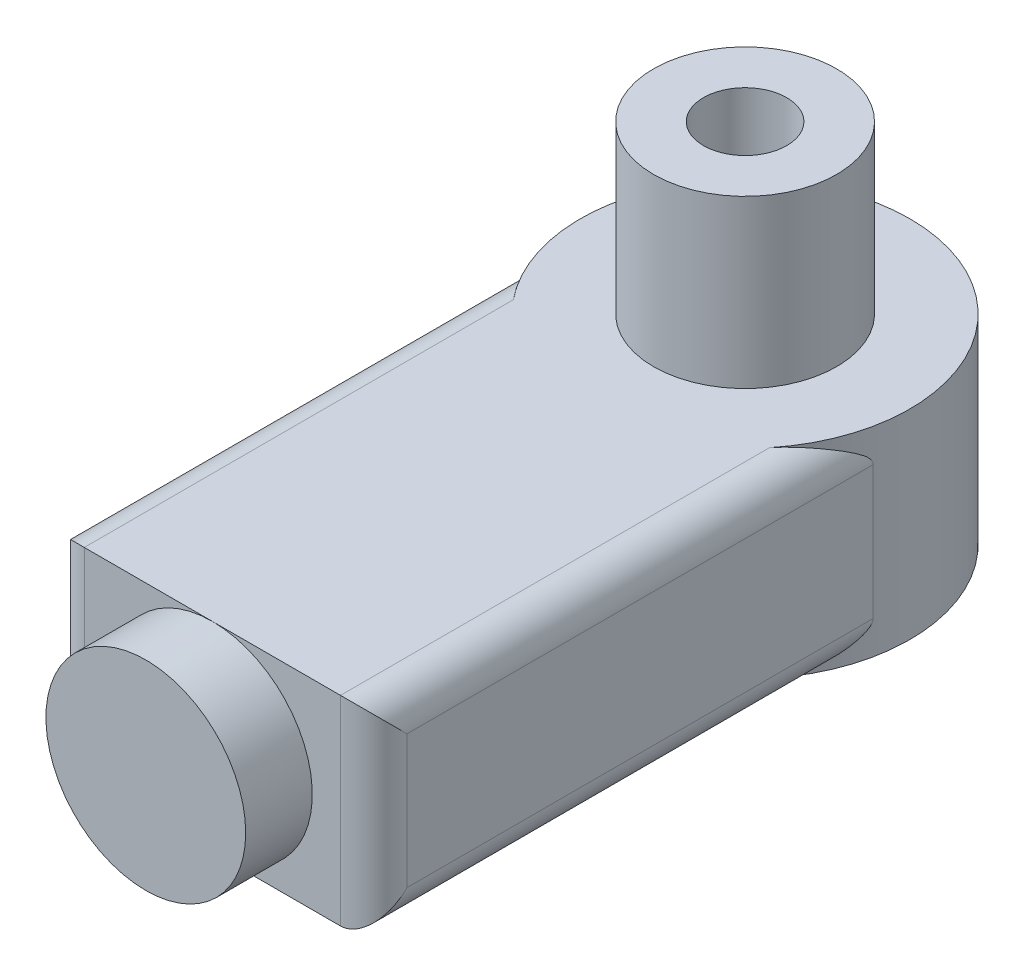
ISO-10303-21;
HEADER;
FILE_DESCRIPTION(('STEP AP214'),'2;1');
FILE_NAME('part.step','',(''),(''),'','','');
FILE_SCHEMA(('AUTOMOTIVE_DESIGN { 1 0 10303 214 1 1 1 1 }'));
ENDSEC;
DATA;
#1=APPLICATION_CONTEXT('core data for automotive mechanical design processes');
#2=APPLICATION_PROTOCOL_DEFINITION('international standard','automotive_design',2000,#1);
#3=PRODUCT_CONTEXT('',#1,'mechanical');
#4=PRODUCT('Part','Part','',(#3));
#5=PRODUCT_RELATED_PRODUCT_CATEGORY('part','',(#4));
#6=PRODUCT_DEFINITION_FORMATION('','',#4);
#7=PRODUCT_DEFINITION_CONTEXT('part definition',#1,'design');
#8=PRODUCT_DEFINITION('design','',#6,#7);
#9=PRODUCT_DEFINITION_SHAPE('','',#8);
#10=(LENGTH_UNIT() NAMED_UNIT(*) SI_UNIT(.MILLI.,.METRE.));
#11=(NAMED_UNIT(*) PLANE_ANGLE_UNIT() SI_UNIT($,.RADIAN.));
#12=(NAMED_UNIT(*) SI_UNIT($,.STERADIAN.) SOLID_ANGLE_UNIT());
#13=UNCERTAINTY_MEASURE_WITH_UNIT(LENGTH_MEASURE(1.E-05),#10,'distance_accuracy_value','');
#14=(GEOMETRIC_REPRESENTATION_CONTEXT(3) GLOBAL_UNCERTAINTY_ASSIGNED_CONTEXT((#13)) GLOBAL_UNIT_ASSIGNED_CONTEXT((#10,
#11,#12)) REPRESENTATION_CONTEXT('',''));
#15=CARTESIAN_POINT('',(0.,0.,0.));
#16=DIRECTION('',(0.,0.,1.));
#17=DIRECTION('',(1.,0.,0.));
#18=AXIS2_PLACEMENT_3D('',#15,#16,#17);
#19=CARTESIAN_POINT('',(0.,11.,0.));
#20=DIRECTION('',(0.,1.,0.));
#21=DIRECTION('',(0.,0.,1.));
#22=AXIS2_PLACEMENT_3D('',#19,#20,#21);
#23=PLANE('',#22);
#24=CARTESIAN_POINT('',(0.,11.,0.));
#25=DIRECTION('',(0.,1.,0.));
#26=DIRECTION('',(0.,0.,1.));
#27=AXIS2_PLACEMENT_3D('',#24,#25,#26);
#28=CIRCLE('',#27,2.75);
#29=CARTESIAN_POINT('',(0.,11.,2.75));
#30=VERTEX_POINT('',#29);
#31=EDGE_CURVE('E11',#30,#30,#28,.T.);
#32=ORIENTED_EDGE('',*,*,#31,.T.);
#33=EDGE_LOOP('',(#32));
#34=FACE_BOUND('',#33,.T.);
#35=CARTESIAN_POINT('',(0.,11.,0.));
#36=DIRECTION('',(0.,1.,0.));
#37=DIRECTION('',(0.,0.,1.));
#38=AXIS2_PLACEMENT_3D('',#35,#36,#37);
#39=CIRCLE('',#38,1.25);
#40=CARTESIAN_POINT('',(0.,11.,1.25));
#41=VERTEX_POINT('',#40);
#42=EDGE_CURVE('E51',#41,#41,#39,.T.);
#43=ORIENTED_EDGE('',*,*,#42,.F.);
#44=EDGE_LOOP('',(#43));
#45=FACE_BOUND('',#44,.T.);
#46=ADVANCED_FACE('F40',(#34,#45),#23,.T.);
#47=CARTESIAN_POINT('',(0.,6.,0.));
#48=DIRECTION('',(0.,1.,0.));
#49=DIRECTION('',(0.,0.,1.));
#50=AXIS2_PLACEMENT_3D('',#47,#48,#49);
#51=PLANE('',#50);
#52=CARTESIAN_POINT('',(0.,6.,0.));
#53=DIRECTION('',(0.,1.,0.));
#54=DIRECTION('',(0.,0.,1.));
#55=AXIS2_PLACEMENT_3D('',#52,#53,#54);
#56=CIRCLE('',#55,2.75);
#57=CARTESIAN_POINT('',(0.,6.,2.75));
#58=VERTEX_POINT('',#57);
#59=EDGE_CURVE('E44',#58,#58,#56,.T.);
#60=ORIENTED_EDGE('',*,*,#59,.F.);
#61=EDGE_LOOP('',(#60));
#62=FACE_BOUND('',#61,.T.);
#63=CARTESIAN_POINT('',(0.,6.,0.));
#64=DIRECTION('',(0.,1.,0.));
#65=DIRECTION('',(0.,0.,1.));
#66=AXIS2_PLACEMENT_3D('',#63,#64,#65);
#67=CIRCLE('',#66,1.25);
#68=CARTESIAN_POINT('',(0.,6.,1.25));
#69=VERTEX_POINT('',#68);
#70=EDGE_CURVE('E53',#69,#69,#67,.T.);
#71=ORIENTED_EDGE('',*,*,#70,.T.);
#72=EDGE_LOOP('',(#71));
#73=FACE_BOUND('',#72,.T.);
#74=ADVANCED_FACE('F63',(#62,#73),#51,.F.);
#75=CARTESIAN_POINT('',(0.,11.,0.));
#76=DIRECTION('',(0.,-1.,0.));
#77=DIRECTION('',(0.,0.,-1.));
#78=AXIS2_PLACEMENT_3D('',#75,#76,#77);
#79=CYLINDRICAL_SURFACE('',#78,2.75);
#80=ORIENTED_EDGE('',*,*,#31,.F.);
#81=EDGE_LOOP('',(#80));
#82=FACE_BOUND('',#81,.T.);
#83=ORIENTED_EDGE('',*,*,#59,.T.);
#84=EDGE_LOOP('',(#83));
#85=FACE_BOUND('',#84,.T.);
#86=ADVANCED_FACE('F42',(#82,#85),#79,.T.);
#87=CARTESIAN_POINT('',(0.,11.,0.));
#88=DIRECTION('',(0.,-1.,0.));
#89=DIRECTION('',(0.,0.,-1.));
#90=AXIS2_PLACEMENT_3D('',#87,#88,#89);
#91=CYLINDRICAL_SURFACE('',#90,1.25);
#92=ORIENTED_EDGE('',*,*,#42,.T.);
#93=EDGE_LOOP('',(#92));
#94=FACE_BOUND('',#93,.T.);
#95=ORIENTED_EDGE('',*,*,#70,.F.);
#96=EDGE_LOOP('',(#95));
#97=FACE_BOUND('',#96,.T.);
#98=ADVANCED_FACE('F59',(#94,#97),#91,.F.);
#99=CLOSED_SHELL('',(#46,#74,#86,#98));
#100=MANIFOLD_SOLID_BREP('B2',#99);
#101=CARTESIAN_POINT('',(-4.84736548441316,6.,16.));
#102=DIRECTION('',(0.,0.,-1.));
#103=DIRECTION('',(-1.,0.,0.));
#104=AXIS2_PLACEMENT_3D('',#101,#102,#103);
#105=PLANE('',#104);
#106=DIRECTION('',(1.,0.,0.));
#107=VECTOR('',#106,1.);
#108=CARTESIAN_POINT('',(-4.84736548441316,6.,16.));
#109=LINE('',#108,#107);
#110=CARTESIAN_POINT('',(-3.84736548441316,6.,16.));
#111=VERTEX_POINT('',#110);
#112=CARTESIAN_POINT('',(0.,6.,16.));
#113=VERTEX_POINT('',#112);
#114=EDGE_CURVE('E178',#111,#113,#109,.T.);
#115=ORIENTED_EDGE('',*,*,#114,.F.);
#116=DIRECTION('',(0.,-1.,0.));
#117=VECTOR('',#116,1.);
#118=CARTESIAN_POINT('',(-3.84736548441316,6.,16.));
#119=LINE('',#118,#117);
#120=CARTESIAN_POINT('',(-3.84736548441316,0.,16.));
#121=VERTEX_POINT('',#120);
#122=EDGE_CURVE('E239',#111,#121,#119,.T.);
#123=ORIENTED_EDGE('',*,*,#122,.T.);
#124=DIRECTION('',(1.,0.,0.));
#125=VECTOR('',#124,1.);
#126=CARTESIAN_POINT('',(-4.84736548441316,0.,16.));
#127=LINE('',#126,#125);
#128=CARTESIAN_POINT('',(0.,0.,16.));
#129=VERTEX_POINT('',#128);
#130=EDGE_CURVE('E202',#121,#129,#127,.T.);
#131=ORIENTED_EDGE('',*,*,#130,.T.);
#132=CARTESIAN_POINT('',(0.,3.,16.));
#133=DIRECTION('',(0.,0.,1.));
#134=DIRECTION('',(1.,0.,0.));
#135=AXIS2_PLACEMENT_3D('',#132,#133,#134);
#136=CIRCLE('',#135,3.);
#137=EDGE_CURVE('E200',#113,#129,#136,.T.);
#138=ORIENTED_EDGE('',*,*,#137,.F.);
#139=EDGE_LOOP('',(#115,#123,#131,#138));
#140=FACE_BOUND('',#139,.T.);
#141=ADVANCED_FACE('F101',(#140),#105,.F.);
#142=CARTESIAN_POINT('',(4.84736548441316,6.,1.));
#143=DIRECTION('',(1.,0.,0.));
#144=DIRECTION('',(0.,0.,-1.));
#145=AXIS2_PLACEMENT_3D('',#142,#143,#144);
#146=PLANE('',#145);
#147=DIRECTION('',(0.,-1.,0.));
#148=VECTOR('',#147,1.);
#149=CARTESIAN_POINT('',(4.84736548441316,6.,1.));
#150=LINE('',#149,#148);
#151=CARTESIAN_POINT('',(4.84736548441316,5.,1.));
#152=VERTEX_POINT('',#151);
#153=CARTESIAN_POINT('',(4.84736548441316,1.,1.));
#154=VERTEX_POINT('',#153);
#155=EDGE_CURVE('E209',#152,#154,#150,.T.);
#156=ORIENTED_EDGE('',*,*,#155,.F.);
#157=DIRECTION('',(0.,0.,1.));
#158=VECTOR('',#157,1.);
#159=CARTESIAN_POINT('',(4.84736548441316,5.,1.));
#160=LINE('',#159,#158);
#161=CARTESIAN_POINT('',(4.84736548441316,5.,15.));
#162=VERTEX_POINT('',#161);
#163=EDGE_CURVE('E237',#152,#162,#160,.T.);
#164=ORIENTED_EDGE('',*,*,#163,.T.);
#165=DIRECTION('',(0.,-1.,0.));
#166=VECTOR('',#165,1.);
#167=CARTESIAN_POINT('',(4.84736548441316,0.,15.));
#168=LINE('',#167,#166);
#169=CARTESIAN_POINT('',(4.84736548441316,1.,15.));
#170=VERTEX_POINT('',#169);
#171=EDGE_CURVE('E119',#162,#170,#168,.T.);
#172=ORIENTED_EDGE('',*,*,#171,.T.);
#173=DIRECTION('',(0.,0.,1.));
#174=VECTOR('',#173,1.);
#175=CARTESIAN_POINT('',(4.84736548441316,1.,1.));
#176=LINE('',#175,#174);
#177=EDGE_CURVE('E235',#170,#154,#176,.F.);
#178=ORIENTED_EDGE('',*,*,#177,.T.);
#179=EDGE_LOOP('',(#156,#164,#172,#178));
#180=FACE_BOUND('',#179,.T.);
#181=ADVANCED_FACE('F269',(#180),#146,.T.);
#182=CARTESIAN_POINT('',(0.,6.,0.));
#183=DIRECTION('',(0.,-1.,0.));
#184=DIRECTION('',(0.,0.,-1.));
#185=AXIS2_PLACEMENT_3D('',#182,#183,#184);
#186=CYLINDRICAL_SURFACE('',#185,4.949439578324);
#187=CARTESIAN_POINT('',(0.,0.,0.));
#188=DIRECTION('',(0.,1.,0.));
#189=DIRECTION('',(0.,0.,1.));
#190=AXIS2_PLACEMENT_3D('',#187,#188,#189);
#191=CIRCLE('',#190,4.949439578324);
#192=CARTESIAN_POINT('',(3.84736548441316,0.,3.11363629360051));
#193=VERTEX_POINT('',#192);
#194=CARTESIAN_POINT('',(-3.84736548441316,0.,3.11363629360051));
#195=VERTEX_POINT('',#194);
#196=EDGE_CURVE('E198',#193,#195,#191,.T.);
#197=ORIENTED_EDGE('',*,*,#196,.T.);
#198=CARTESIAN_POINT('',(-3.84736548441316,0.,3.11363629360051));
#199=CARTESIAN_POINT('',(-3.89281727462984,2.98251887473271E-05,3.05748950664325));
#200=CARTESIAN_POINT('',(-3.93698176868843,0.00309578606745538,3.00038873130443));
#201=CARTESIAN_POINT('',(-4.02248361959575,0.0145027282662336,2.88473823258211));
#202=CARTESIAN_POINT('',(-4.06382505459908,0.0228359140066355,2.8261907731535));
#203=CARTESIAN_POINT('',(-4.14379241616999,0.0440455025861972,2.70759855111725));
#204=CARTESIAN_POINT('',(-4.1824013945703,0.0569477076054911,2.64754712323396));
#205=CARTESIAN_POINT('',(-4.25659452103735,0.0866930339336794,2.52653796459679));
#206=CARTESIAN_POINT('',(-4.29217744110034,0.103537744843388,2.46557987759034));
#207=CARTESIAN_POINT('',(-4.37430758908357,0.148334355198219,2.31779499630878));
#208=CARTESIAN_POINT('',(-4.41934233548354,0.178004666598062,2.23064401736269));
#209=CARTESIAN_POINT('',(-4.50340973320656,0.24339969810394,2.05564856468806));
#210=CARTESIAN_POINT('',(-4.54243684767344,0.279129940287717,1.96780352874191));
#211=CARTESIAN_POINT('',(-4.6143950818412,0.356223323865737,1.79254723900047));
#212=CARTESIAN_POINT('',(-4.6473505445337,0.397562764147221,1.7051356836443));
#213=CARTESIAN_POINT('',(-4.69233533585805,0.46451754732251,1.57513425061422));
#214=CARTESIAN_POINT('',(-4.70658129224892,0.487643962953936,1.53201322572609));
#215=CARTESIAN_POINT('',(-4.73358055597524,0.535897619173316,1.44643483368296));
#216=CARTESIAN_POINT('',(-4.74633449790931,0.561024001417684,1.40397719107821));
#217=CARTESIAN_POINT('',(-4.76640157692205,0.605340815358527,1.33387936626689));
#218=CARTESIAN_POINT('',(-4.77413671419236,0.623809646891943,1.30590417752581));
#219=CARTESIAN_POINT('',(-4.78887204234209,0.662370968508412,1.25078744891224));
#220=CARTESIAN_POINT('',(-4.79587078570187,0.682466523986641,1.22364762250757));
#221=CARTESIAN_POINT('',(-4.80907666095353,0.725019271824503,1.17067757929597));
#222=CARTESIAN_POINT('',(-4.81527654134315,0.747495124216086,1.14486048837391));
#223=CARTESIAN_POINT('',(-4.82659677682991,0.79573727772831,1.096140980642));
#224=CARTESIAN_POINT('',(-4.83172100762228,0.82149120905587,1.07322822170865));
#225=CARTESIAN_POINT('',(-4.83783889189717,0.861766988726351,1.04515337522625));
#226=CARTESIAN_POINT('',(-4.83951910914709,0.874291947268194,1.03733244209698));
#227=CARTESIAN_POINT('',(-4.84246712988467,0.900282907495009,1.02348076336158));
#228=CARTESIAN_POINT('',(-4.84373718901121,0.913743249815438,1.01744024310268));
#229=CARTESIAN_POINT('',(-4.84557994869563,0.939176734383413,1.00862541715542));
#230=CARTESIAN_POINT('',(-4.84623506365502,0.951006954780033,1.00546783298845));
#231=CARTESIAN_POINT('',(-4.84713423241671,0.975202989128045,1.00112136142261));
#232=CARTESIAN_POINT('',(-4.84737237180637,0.987573997427809,0.999960803911347));
#233=CARTESIAN_POINT('',(-4.84736548441316,0.999999999999999,0.999999999999997));
#234=B_SPLINE_CURVE_WITH_KNOTS('',3,(#198,#199,#200,#201,#202,#203,#204,#205,#206,#207,#208,
#209,#210,#211,#212,#213,#214,#215,#216,#217,#218,#219,#220,#221,#222,#223,#224,#225,#226,#227,
#228,#229,#230,#231,#232,#233),.UNSPECIFIED.,.F.,.F.,(4,2,2,2,2,2,2,2,2,2,2,2,2,2,2,2,2,4),(0.,
0.216535143167561,0.432750558753887,0.650206986287944,0.867751242787261,1.17480258975668,
1.48213525381358,1.78820756348574,1.94105134813977,2.09382988553935,2.19700231261004,
2.30037389760481,2.40462608718171,2.50849593910503,2.55297864224975,2.59721237635919,
2.63383074301909,2.67096442323406),.UNSPECIFIED.);
#235=CARTESIAN_POINT('',(-4.84736548441316,1.,1.));
#236=VERTEX_POINT('',#235);
#237=EDGE_CURVE('E251',#195,#236,#234,.T.);
#238=ORIENTED_EDGE('',*,*,#237,.T.);
#239=DIRECTION('',(0.,-1.,0.));
#240=VECTOR('',#239,1.);
#241=CARTESIAN_POINT('',(-4.84736548441316,6.,1.));
#242=LINE('',#241,#240);
#243=CARTESIAN_POINT('',(-4.84736548441316,5.,1.));
#244=VERTEX_POINT('',#243);
#245=EDGE_CURVE('E212',#244,#236,#242,.T.);
#246=ORIENTED_EDGE('',*,*,#245,.F.);
#247=CARTESIAN_POINT('',(-4.84736548441316,5.,1.));
#248=CARTESIAN_POINT('',(-4.84737307595143,5.01288840319748,0.999956672564238));
#249=CARTESIAN_POINT('',(-4.84711669443079,5.02571146266976,1.00120648351606));
#250=CARTESIAN_POINT('',(-4.84615278490311,5.05073461091079,1.00586483364969));
#251=CARTESIAN_POINT('',(-4.84545269217123,5.06294145313959,1.00923778902605));
#252=CARTESIAN_POINT('',(-4.84333944251579,5.09114152817548,1.01933730456198));
#253=CARTESIAN_POINT('',(-4.84175715485132,5.10683283626391,1.02684794291165));
#254=CARTESIAN_POINT('',(-4.83806074716588,5.13694962183925,1.04412621311549));
#255=CARTESIAN_POINT('',(-4.83594253537592,5.15136415268272,1.05391116025544));
#256=CARTESIAN_POINT('',(-4.83064377556704,5.18300593115654,1.07797222741758));
#257=CARTESIAN_POINT('',(-4.82733321470016,5.19983918507957,1.09272842283818));
#258=CARTESIAN_POINT('',(-4.82021820541154,5.23200833359732,1.12370117600226));
#259=CARTESIAN_POINT('',(-4.8164127474761,5.24734105211744,1.13992069740632));
#260=CARTESIAN_POINT('',(-4.80435959186667,5.29174138591236,1.19006579849173));
#261=CARTESIAN_POINT('',(-4.79549994892692,5.31907877696655,1.22536252470867));
#262=CARTESIAN_POINT('',(-4.77777208794515,5.36728882088111,1.29263143008758));
#263=CARTESIAN_POINT('',(-4.76907233976138,5.38853361875683,1.32439395861491));
#264=CARTESIAN_POINT('',(-4.75074971483621,5.42941658524038,1.38868484784914));
#265=CARTESIAN_POINT('',(-4.74112670691308,5.44905452480042,1.42121331688809));
#266=CARTESIAN_POINT('',(-4.71088902393771,5.50615418558199,1.51960007134321));
#267=CARTESIAN_POINT('',(-4.68893574962929,5.54172369720676,1.58614422174335));
#268=CARTESIAN_POINT('',(-4.64153392319824,5.60908422687354,1.71993264734043));
#269=CARTESIAN_POINT('',(-4.61608281262335,5.6408724470882,1.78717740140337));
#270=CARTESIAN_POINT('',(-4.56170667518593,5.70096861321623,1.92172926802425));
#271=CARTESIAN_POINT('',(-4.53278511910078,5.72927997989892,1.98903625257127));
#272=CARTESIAN_POINT('',(-4.47151609529522,5.78235019937197,2.12318556147885));
#273=CARTESIAN_POINT('',(-4.4391804393091,5.80712064498221,2.19002868713708));
#274=CARTESIAN_POINT('',(-4.37095292871354,5.85296293473344,2.32321389411166));
#275=CARTESIAN_POINT('',(-4.33505958767861,5.87403322264572,2.38955575343097));
#276=CARTESIAN_POINT('',(-4.25988643800206,5.91191551355002,2.52111746863686));
#277=CARTESIAN_POINT('',(-4.22062281366412,5.92874649144192,2.58634106076873));
#278=CARTESIAN_POINT('',(-4.13861186511317,5.95763491776477,2.71564009206927));
#279=CARTESIAN_POINT('',(-4.0958656816126,5.9696939217359,2.779715898873));
#280=CARTESIAN_POINT('',(-4.01916638491394,5.9856834482528,2.88901517726619));
#281=CARTESIAN_POINT('',(-3.98600612346842,5.99093509564627,2.93460147514712));
#282=CARTESIAN_POINT('',(-3.91794936830613,5.99809106929837,3.02486965878351));
#283=CARTESIAN_POINT('',(-3.88304948434331,5.99998857392191,3.06954951913067));
#284=CARTESIAN_POINT('',(-3.84736548441316,6.,3.11363629360051));
#285=B_SPLINE_CURVE_WITH_KNOTS('',3,(#247,#248,#249,#250,#251,#252,#253,#254,#255,#256,#257,
#258,#259,#260,#261,#262,#263,#264,#265,#266,#267,#268,#269,#270,#271,#272,#273,#274,#275,#276,
#277,#278,#279,#280,#281,#282,#283,#284),.UNSPECIFIED.,.F.,.F.,(4,2,2,2,2,2,2,2,2,2,2,2,2,2,2,2,
2,2,4),(0.,0.0384975484795086,0.0763664584605771,0.12847304669167,0.180990150672357,
0.248712757349987,0.316575740488891,0.452828711529017,0.57035870826645,0.687905429103769,
0.923425139799945,1.15911804472619,1.39457716857923,1.62924683058992,1.86401495584782,
2.09771281283462,2.33133442748244,2.50105659500522,2.67112354699958),.UNSPECIFIED.);
#286=CARTESIAN_POINT('',(-3.84736548441316,6.,3.11363629360051));
#287=VERTEX_POINT('',#286);
#288=EDGE_CURVE('E242',#244,#287,#285,.T.);
#289=ORIENTED_EDGE('',*,*,#288,.T.);
#290=CARTESIAN_POINT('',(0.,6.,0.));
#291=DIRECTION('',(0.,1.,0.));
#292=DIRECTION('',(0.,0.,1.));
#293=AXIS2_PLACEMENT_3D('',#290,#291,#292);
#294=CIRCLE('',#293,4.949439578324);
#295=CARTESIAN_POINT('',(3.84736548441316,6.,3.11363629360051));
#296=VERTEX_POINT('',#295);
#297=EDGE_CURVE('E187',#296,#287,#294,.T.);
#298=ORIENTED_EDGE('',*,*,#297,.F.);
#299=CARTESIAN_POINT('',(3.84736548441316,6.,3.11363629360051));
#300=CARTESIAN_POINT('',(3.89281727462984,5.99997017481125,3.05748950664325));
#301=CARTESIAN_POINT('',(3.93698176868843,5.99690421393254,3.00038873130443));
#302=CARTESIAN_POINT('',(4.02248361959575,5.98549727173377,2.88473823258211));
#303=CARTESIAN_POINT('',(4.06382505459908,5.97716408599336,2.8261907731535));
#304=CARTESIAN_POINT('',(4.14379241616999,5.9559544974138,2.70759855111725));
#305=CARTESIAN_POINT('',(4.1824013945703,5.94305229239451,2.64754712323396));
#306=CARTESIAN_POINT('',(4.25659452103735,5.91330696606632,2.52653796459679));
#307=CARTESIAN_POINT('',(4.29217744110034,5.89646225515661,2.46557987759034));
#308=CARTESIAN_POINT('',(4.37430758908357,5.85166564480178,2.31779499630878));
#309=CARTESIAN_POINT('',(4.41934233548354,5.82199533340194,2.23064401736269));
#310=CARTESIAN_POINT('',(4.50340973320656,5.75660030189606,2.05564856468806));
#311=CARTESIAN_POINT('',(4.54243684767344,5.72087005971228,1.96780352874191));
#312=CARTESIAN_POINT('',(4.6143950818412,5.64377667613426,1.79254723900047));
#313=CARTESIAN_POINT('',(4.6473505445337,5.60243723585278,1.7051356836443));
#314=CARTESIAN_POINT('',(4.69233533585805,5.53548245267749,1.57513425061422));
#315=CARTESIAN_POINT('',(4.70658129224892,5.51235603704606,1.53201322572609));
#316=CARTESIAN_POINT('',(4.73358055597524,5.46410238082668,1.44643483368296));
#317=CARTESIAN_POINT('',(4.74633449790931,5.43897599858232,1.40397719107821));
#318=CARTESIAN_POINT('',(4.76640157692205,5.39465918464147,1.33387936626689));
#319=CARTESIAN_POINT('',(4.77413671419236,5.37619035310806,1.30590417752581));
#320=CARTESIAN_POINT('',(4.78887204234209,5.33762903149159,1.25078744891224));
#321=CARTESIAN_POINT('',(4.79587078570187,5.31753347601336,1.22364762250757));
#322=CARTESIAN_POINT('',(4.80907666095353,5.2749807281755,1.17067757929597));
#323=CARTESIAN_POINT('',(4.81527654134315,5.25250487578391,1.14486048837391));
#324=CARTESIAN_POINT('',(4.8265967768299,5.20426272227169,1.096140980642));
#325=CARTESIAN_POINT('',(4.83172100762228,5.17850879094413,1.07322822170865));
#326=CARTESIAN_POINT('',(4.83783889189717,5.13823301127365,1.04515337522625));
#327=CARTESIAN_POINT('',(4.83951910914709,5.1257080527318,1.03733244209698));
#328=CARTESIAN_POINT('',(4.84246712988467,5.09971709250499,1.02348076336158));
#329=CARTESIAN_POINT('',(4.84373718901121,5.08625675018456,1.01744024310268));
#330=CARTESIAN_POINT('',(4.84557994869563,5.06082326561658,1.00862541715542));
#331=CARTESIAN_POINT('',(4.84623506365502,5.04899304521996,1.00546783298845));
#332=CARTESIAN_POINT('',(4.84713423241671,5.02479701087195,1.00112136142261));
#333=CARTESIAN_POINT('',(4.84737237180637,5.01242600257219,0.999960803911347));
#334=CARTESIAN_POINT('',(4.84736548441316,5.,0.999999999999997));
#335=B_SPLINE_CURVE_WITH_KNOTS('',3,(#299,#300,#301,#302,#303,#304,#305,#306,#307,#308,#309,
#310,#311,#312,#313,#314,#315,#316,#317,#318,#319,#320,#321,#322,#323,#324,#325,#326,#327,#328,
#329,#330,#331,#332,#333,#334),.UNSPECIFIED.,.F.,.F.,(4,2,2,2,2,2,2,2,2,2,2,2,2,2,2,2,2,4),(0.,
0.216535143167561,0.432750558753888,0.650206986287944,0.867751242787261,1.17480258975668,
1.48213525381358,1.78820756348574,1.94105134813977,2.09382988553935,2.19700231261004,
2.30037389760481,2.40462608718171,2.50849593910503,2.55297864224975,2.59721237635919,
2.63383074301909,2.67096442323406),.UNSPECIFIED.);
#336=EDGE_CURVE('E111',#296,#152,#335,.T.);
#337=ORIENTED_EDGE('',*,*,#336,.T.);
#338=ORIENTED_EDGE('',*,*,#155,.T.);
#339=CARTESIAN_POINT('',(4.84736548441316,1.,1.));
#340=CARTESIAN_POINT('',(4.84737307595143,0.987111596802519,0.999956672564239));
#341=CARTESIAN_POINT('',(4.84711669443079,0.974288537330241,1.00120648351606));
#342=CARTESIAN_POINT('',(4.84615278490311,0.949265389089207,1.00586483364969));
#343=CARTESIAN_POINT('',(4.84545269217123,0.937058546860406,1.00923778902605));
#344=CARTESIAN_POINT('',(4.84333944251579,0.908858471824523,1.01933730456198));
#345=CARTESIAN_POINT('',(4.84175715485132,0.893167163736092,1.02684794291166));
#346=CARTESIAN_POINT('',(4.83806074716588,0.863050378160746,1.0441262131155));
#347=CARTESIAN_POINT('',(4.83594253537592,0.848635847317282,1.05391116025544));
#348=CARTESIAN_POINT('',(4.83064377556704,0.816994068843457,1.07797222741759));
#349=CARTESIAN_POINT('',(4.82733321470016,0.800160814920428,1.09272842283818));
#350=CARTESIAN_POINT('',(4.82021820541154,0.767991666402679,1.12370117600227));
#351=CARTESIAN_POINT('',(4.8164127474761,0.752658947882564,1.13992069740632));
#352=CARTESIAN_POINT('',(4.80435959186667,0.708258614087636,1.19006579849174));
#353=CARTESIAN_POINT('',(4.79549994892692,0.680921223033447,1.22536252470867));
#354=CARTESIAN_POINT('',(4.77777208794515,0.632711179118887,1.29263143008758));
#355=CARTESIAN_POINT('',(4.76907233976138,0.61146638124317,1.32439395861491));
#356=CARTESIAN_POINT('',(4.75074971483621,0.57058341475962,1.38868484784914));
#357=CARTESIAN_POINT('',(4.74112670691308,0.55094547519958,1.42121331688809));
#358=CARTESIAN_POINT('',(4.71088902393771,0.493845814418007,1.51960007134321));
#359=CARTESIAN_POINT('',(4.68893574962929,0.458276302793236,1.58614422174336));
#360=CARTESIAN_POINT('',(4.64153392319824,0.390915773126458,1.71993264734043));
#361=CARTESIAN_POINT('',(4.61608281262335,0.3591275529118,1.78717740140337));
#362=CARTESIAN_POINT('',(4.56170667518593,0.29903138678377,1.92172926802425));
#363=CARTESIAN_POINT('',(4.53278511910078,0.270720020101078,1.98903625257127));
#364=CARTESIAN_POINT('',(4.47151609529522,0.217649800628031,2.12318556147885));
#365=CARTESIAN_POINT('',(4.4391804393091,0.192879355017789,2.19002868713708));
#366=CARTESIAN_POINT('',(4.37095292871354,0.147037065266563,2.32321389411166));
#367=CARTESIAN_POINT('',(4.33505958767861,0.125966777354279,2.38955575343097));
#368=CARTESIAN_POINT('',(4.25988643800206,0.0880844864499766,2.52111746863686));
#369=CARTESIAN_POINT('',(4.22062281366412,0.0712535085580823,2.58634106076873));
#370=CARTESIAN_POINT('',(4.13861186511317,0.0423650822352342,2.71564009206927));
#371=CARTESIAN_POINT('',(4.0958656816126,0.0303060782641058,2.779715898873));
#372=CARTESIAN_POINT('',(4.01916638491394,0.0143165517471987,2.88901517726619));
#373=CARTESIAN_POINT('',(3.98600612346842,0.00906490435372658,2.93460147514712));
#374=CARTESIAN_POINT('',(3.91794936830613,0.00190893070163007,3.02486965878351));
#375=CARTESIAN_POINT('',(3.88304948434331,1.14260780926861E-05,3.06954951913067));
#376=CARTESIAN_POINT('',(3.84736548441316,0.,3.11363629360051));
#377=B_SPLINE_CURVE_WITH_KNOTS('',3,(#339,#340,#341,#342,#343,#344,#345,#346,#347,#348,#349,
#350,#351,#352,#353,#354,#355,#356,#357,#358,#359,#360,#361,#362,#363,#364,#365,#366,#367,#368,
#369,#370,#371,#372,#373,#374,#375,#376),.UNSPECIFIED.,.F.,.F.,(4,2,2,2,2,2,2,2,2,2,2,2,2,2,2,2,
2,2,4),(0.,0.038497548479509,0.0763664584605773,0.128473046691671,0.180990150672359,
0.248712757349988,0.316575740488893,0.452828711529018,0.570358708266452,0.68790542910377,
0.923425139799946,1.15911804472619,1.39457716857923,1.62924683058992,1.86401495584781,
2.09771281283462,2.33133442748244,2.50105659500522,2.67112354699958),.UNSPECIFIED.);
#378=EDGE_CURVE('E38',#154,#193,#377,.T.);
#379=ORIENTED_EDGE('',*,*,#378,.T.);
#380=EDGE_LOOP('',(#197,#238,#246,#289,#298,#337,#338,#379));
#381=FACE_BOUND('',#380,.T.);
#382=ADVANCED_FACE('F258',(#381),#186,.T.);
#383=CARTESIAN_POINT('',(-4.84736548441316,6.,1.));
#384=DIRECTION('',(1.,0.,0.));
#385=DIRECTION('',(0.,0.,-1.));
#386=AXIS2_PLACEMENT_3D('',#383,#384,#385);
#387=PLANE('',#386);
#388=DIRECTION('',(0.,-1.,0.));
#389=VECTOR('',#388,1.);
#390=CARTESIAN_POINT('',(-4.84736548441316,6.,15.));
#391=LINE('',#390,#389);
#392=CARTESIAN_POINT('',(-4.84736548441316,1.,15.));
#393=VERTEX_POINT('',#392);
#394=CARTESIAN_POINT('',(-4.84736548441316,5.,15.));
#395=VERTEX_POINT('',#394);
#396=EDGE_CURVE('E223',#393,#395,#391,.F.);
#397=ORIENTED_EDGE('',*,*,#396,.T.);
#398=DIRECTION('',(0.,0.,1.));
#399=VECTOR('',#398,1.);
#400=CARTESIAN_POINT('',(-4.84736548441316,5.,1.));
#401=LINE('',#400,#399);
#402=EDGE_CURVE('E227',#395,#244,#401,.F.);
#403=ORIENTED_EDGE('',*,*,#402,.T.);
#404=ORIENTED_EDGE('',*,*,#245,.T.);
#405=DIRECTION('',(0.,0.,1.));
#406=VECTOR('',#405,1.);
#407=CARTESIAN_POINT('',(-4.84736548441316,1.,1.));
#408=LINE('',#407,#406);
#409=EDGE_CURVE('E225',#236,#393,#408,.T.);
#410=ORIENTED_EDGE('',*,*,#409,.T.);
#411=EDGE_LOOP('',(#397,#403,#404,#410));
#412=FACE_BOUND('',#411,.T.);
#413=ADVANCED_FACE('F317',(#412),#387,.F.);
#414=CARTESIAN_POINT('',(3.84736548441316,0.,16.));
#415=VERTEX_POINT('',#414);
#416=EDGE_CURVE('E218',#129,#415,#127,.T.);
#417=ORIENTED_EDGE('',*,*,#416,.T.);
#418=DIRECTION('',(0.,-1.,0.));
#419=VECTOR('',#418,1.);
#420=CARTESIAN_POINT('',(3.84736548441316,6.,16.));
#421=LINE('',#420,#419);
#422=CARTESIAN_POINT('',(3.84736548441316,6.,16.));
#423=VERTEX_POINT('',#422);
#424=EDGE_CURVE('E197',#415,#423,#421,.F.);
#425=ORIENTED_EDGE('',*,*,#424,.T.);
#426=EDGE_CURVE('E182',#113,#423,#109,.T.);
#427=ORIENTED_EDGE('',*,*,#426,.F.);
#428=EDGE_CURVE('E194',#129,#113,#136,.T.);
#429=ORIENTED_EDGE('',*,*,#428,.F.);
#430=EDGE_LOOP('',(#417,#425,#427,#429));
#431=FACE_BOUND('',#430,.T.);
#432=ADVANCED_FACE('F192',(#431),#105,.F.);
#433=CARTESIAN_POINT('',(0.,6.,0.));
#434=DIRECTION('',(0.,1.,0.));
#435=DIRECTION('',(0.,0.,1.));
#436=AXIS2_PLACEMENT_3D('',#433,#434,#435);
#437=PLANE('',#436);
#438=ORIENTED_EDGE('',*,*,#297,.T.);
#439=DIRECTION('',(0.,0.,1.));
#440=VECTOR('',#439,1.);
#441=CARTESIAN_POINT('',(-3.84736548441316,6.,16.));
#442=LINE('',#441,#440);
#443=EDGE_CURVE('E184',#287,#111,#442,.T.);
#444=ORIENTED_EDGE('',*,*,#443,.T.);
#445=ORIENTED_EDGE('',*,*,#114,.T.);
#446=ORIENTED_EDGE('',*,*,#426,.T.);
#447=DIRECTION('',(0.,0.,1.));
#448=VECTOR('',#447,1.);
#449=CARTESIAN_POINT('',(3.84736548441316,6.,0.));
#450=LINE('',#449,#448);
#451=EDGE_CURVE('E208',#423,#296,#450,.F.);
#452=ORIENTED_EDGE('',*,*,#451,.T.);
#453=EDGE_LOOP('',(#438,#444,#445,#446,#452));
#454=FACE_BOUND('',#453,.T.);
#455=ADVANCED_FACE('F180',(#454),#437,.T.);
#456=CARTESIAN_POINT('',(0.,0.,0.));
#457=DIRECTION('',(0.,1.,0.));
#458=DIRECTION('',(0.,0.,1.));
#459=AXIS2_PLACEMENT_3D('',#456,#457,#458);
#460=PLANE('',#459);
#461=ORIENTED_EDGE('',*,*,#130,.F.);
#462=DIRECTION('',(0.,0.,1.));
#463=VECTOR('',#462,1.);
#464=CARTESIAN_POINT('',(-3.84736548441316,0.,0.));
#465=LINE('',#464,#463);
#466=EDGE_CURVE('E231',#121,#195,#465,.F.);
#467=ORIENTED_EDGE('',*,*,#466,.T.);
#468=ORIENTED_EDGE('',*,*,#196,.F.);
#469=DIRECTION('',(0.,0.,1.));
#470=VECTOR('',#469,1.);
#471=CARTESIAN_POINT('',(3.84736548441316,0.,16.));
#472=LINE('',#471,#470);
#473=EDGE_CURVE('E229',#193,#415,#472,.T.);
#474=ORIENTED_EDGE('',*,*,#473,.T.);
#475=ORIENTED_EDGE('',*,*,#416,.F.);
#476=EDGE_LOOP('',(#461,#467,#468,#474,#475));
#477=FACE_BOUND('',#476,.T.);
#478=ADVANCED_FACE('F313',(#477),#460,.F.);
#479=CARTESIAN_POINT('',(0.,3.,18.));
#480=DIRECTION('',(0.,0.,-1.));
#481=DIRECTION('',(-1.,0.,0.));
#482=AXIS2_PLACEMENT_3D('',#479,#480,#481);
#483=CYLINDRICAL_SURFACE('',#482,3.);
#484=CARTESIAN_POINT('',(0.,3.,18.));
#485=DIRECTION('',(0.,0.,1.));
#486=DIRECTION('',(1.,0.,0.));
#487=AXIS2_PLACEMENT_3D('',#484,#485,#486);
#488=CIRCLE('',#487,3.);
#489=CARTESIAN_POINT('',(3.,3.,18.));
#490=VERTEX_POINT('',#489);
#491=EDGE_CURVE('E204',#490,#490,#488,.T.);
#492=ORIENTED_EDGE('',*,*,#491,.F.);
#493=EDGE_LOOP('',(#492));
#494=FACE_BOUND('',#493,.T.);
#495=ORIENTED_EDGE('',*,*,#137,.T.);
#496=ORIENTED_EDGE('',*,*,#428,.T.);
#497=EDGE_LOOP('',(#495,#496));
#498=FACE_BOUND('',#497,.T.);
#499=ADVANCED_FACE('F207',(#494,#498),#483,.T.);
#500=CARTESIAN_POINT('',(0.,3.,18.));
#501=DIRECTION('',(0.,0.,1.));
#502=DIRECTION('',(1.,0.,0.));
#503=AXIS2_PLACEMENT_3D('',#500,#501,#502);
#504=PLANE('',#503);
#505=ORIENTED_EDGE('',*,*,#491,.T.);
#506=EDGE_LOOP('',(#505));
#507=FACE_BOUND('',#506,.T.);
#508=ADVANCED_FACE('F277',(#507),#504,.T.);
#509=CARTESIAN_POINT('',(-3.84736548441316,1.,1.));
#510=DIRECTION('',(0.,0.,1.));
#511=DIRECTION('',(1.,0.,0.));
#512=AXIS2_PLACEMENT_3D('',#509,#510,#511);
#513=CYLINDRICAL_SURFACE('',#512,1.);
#514=ORIENTED_EDGE('',*,*,#237,.F.);
#515=ORIENTED_EDGE('',*,*,#466,.F.);
#516=CARTESIAN_POINT('',(-3.84736548441316,1.,15.));
#517=DIRECTION('',(0.,-0.707106781186547,-0.707106781186547));
#518=DIRECTION('',(0.,-0.707106781186547,0.707106781186547));
#519=AXIS2_PLACEMENT_3D('',#516,#517,#518);
#520=ELLIPSE('',#519,1.41421356237309,1.);
#521=EDGE_CURVE('E205',#393,#121,#520,.F.);
#522=ORIENTED_EDGE('',*,*,#521,.F.);
#523=ORIENTED_EDGE('',*,*,#409,.F.);
#524=EDGE_LOOP('',(#514,#515,#522,#523));
#525=FACE_BOUND('',#524,.T.);
#526=ADVANCED_FACE('F272',(#525),#513,.T.);
#527=CARTESIAN_POINT('',(-3.84736548441316,6.,15.));
#528=DIRECTION('',(0.,-1.,0.));
#529=DIRECTION('',(0.,0.,-1.));
#530=AXIS2_PLACEMENT_3D('',#527,#528,#529);
#531=CYLINDRICAL_SURFACE('',#530,1.);
#532=ORIENTED_EDGE('',*,*,#521,.T.);
#533=ORIENTED_EDGE('',*,*,#122,.F.);
#534=CARTESIAN_POINT('',(-3.84736548441316,5.,15.));
#535=DIRECTION('',(0.,-0.707106781186547,0.707106781186547));
#536=DIRECTION('',(0.,-0.707106781186547,-0.707106781186547));
#537=AXIS2_PLACEMENT_3D('',#534,#535,#536);
#538=ELLIPSE('',#537,1.41421356237309,1.);
#539=EDGE_CURVE('E292',#395,#111,#538,.F.);
#540=ORIENTED_EDGE('',*,*,#539,.F.);
#541=ORIENTED_EDGE('',*,*,#396,.F.);
#542=EDGE_LOOP('',(#532,#533,#540,#541));
#543=FACE_BOUND('',#542,.T.);
#544=ADVANCED_FACE('F267',(#543),#531,.T.);
#545=CARTESIAN_POINT('',(-3.84736548441316,5.,0.));
#546=DIRECTION('',(0.,0.,-1.));
#547=DIRECTION('',(-1.,0.,0.));
#548=AXIS2_PLACEMENT_3D('',#545,#546,#547);
#549=CYLINDRICAL_SURFACE('',#548,1.);
#550=ORIENTED_EDGE('',*,*,#288,.F.);
#551=ORIENTED_EDGE('',*,*,#402,.F.);
#552=ORIENTED_EDGE('',*,*,#539,.T.);
#553=ORIENTED_EDGE('',*,*,#443,.F.);
#554=EDGE_LOOP('',(#550,#551,#552,#553));
#555=FACE_BOUND('',#554,.T.);
#556=ADVANCED_FACE('F262',(#555),#549,.T.);
#557=CARTESIAN_POINT('',(3.84736548441316,1.,0.));
#558=DIRECTION('',(0.,0.,-1.));
#559=DIRECTION('',(-1.,0.,0.));
#560=AXIS2_PLACEMENT_3D('',#557,#558,#559);
#561=CYLINDRICAL_SURFACE('',#560,1.);
#562=ORIENTED_EDGE('',*,*,#378,.F.);
#563=ORIENTED_EDGE('',*,*,#177,.F.);
#564=CARTESIAN_POINT('',(3.84736548441316,1.,15.));
#565=DIRECTION('',(0.,0.707106781186547,0.707106781186547));
#566=DIRECTION('',(0.,0.707106781186547,-0.707106781186547));
#567=AXIS2_PLACEMENT_3D('',#564,#565,#566);
#568=ELLIPSE('',#567,1.41421356237309,1.);
#569=EDGE_CURVE('E106',#415,#170,#568,.T.);
#570=ORIENTED_EDGE('',*,*,#569,.F.);
#571=ORIENTED_EDGE('',*,*,#473,.F.);
#572=EDGE_LOOP('',(#562,#563,#570,#571));
#573=FACE_BOUND('',#572,.T.);
#574=ADVANCED_FACE('F103',(#573),#561,.T.);
#575=CARTESIAN_POINT('',(3.84736548441316,6.,15.));
#576=DIRECTION('',(0.,1.,0.));
#577=DIRECTION('',(0.,0.,1.));
#578=AXIS2_PLACEMENT_3D('',#575,#576,#577);
#579=CYLINDRICAL_SURFACE('',#578,1.);
#580=ORIENTED_EDGE('',*,*,#569,.T.);
#581=ORIENTED_EDGE('',*,*,#171,.F.);
#582=CARTESIAN_POINT('',(3.84736548441316,5.,15.));
#583=DIRECTION('',(0.,0.707106781186547,-0.707106781186547));
#584=DIRECTION('',(0.,0.707106781186547,0.707106781186547));
#585=AXIS2_PLACEMENT_3D('',#582,#583,#584);
#586=ELLIPSE('',#585,1.41421356237309,1.);
#587=EDGE_CURVE('E127',#423,#162,#586,.T.);
#588=ORIENTED_EDGE('',*,*,#587,.F.);
#589=ORIENTED_EDGE('',*,*,#424,.F.);
#590=EDGE_LOOP('',(#580,#581,#588,#589));
#591=FACE_BOUND('',#590,.T.);
#592=ADVANCED_FACE('F282',(#591),#579,.T.);
#593=CARTESIAN_POINT('',(3.84736548441316,5.,1.));
#594=DIRECTION('',(0.,0.,1.));
#595=DIRECTION('',(1.,0.,0.));
#596=AXIS2_PLACEMENT_3D('',#593,#594,#595);
#597=CYLINDRICAL_SURFACE('',#596,1.);
#598=ORIENTED_EDGE('',*,*,#336,.F.);
#599=ORIENTED_EDGE('',*,*,#451,.F.);
#600=ORIENTED_EDGE('',*,*,#587,.T.);
#601=ORIENTED_EDGE('',*,*,#163,.F.);
#602=EDGE_LOOP('',(#598,#599,#600,#601));
#603=FACE_BOUND('',#602,.T.);
#604=ADVANCED_FACE('F279',(#603),#597,.T.);
#605=CLOSED_SHELL('',(#141,#181,#382,#413,#432,#455,#478,#499,#508,#526,#544,#556,#574,#592,#604));
#606=MANIFOLD_SOLID_BREP('B6',#605);
#607=ADVANCED_BREP_SHAPE_REPRESENTATION('',(#18,#100,#606),#14);
#608=SHAPE_DEFINITION_REPRESENTATION(#9,#607);
ENDSEC;
END-ISO-10303-21;
